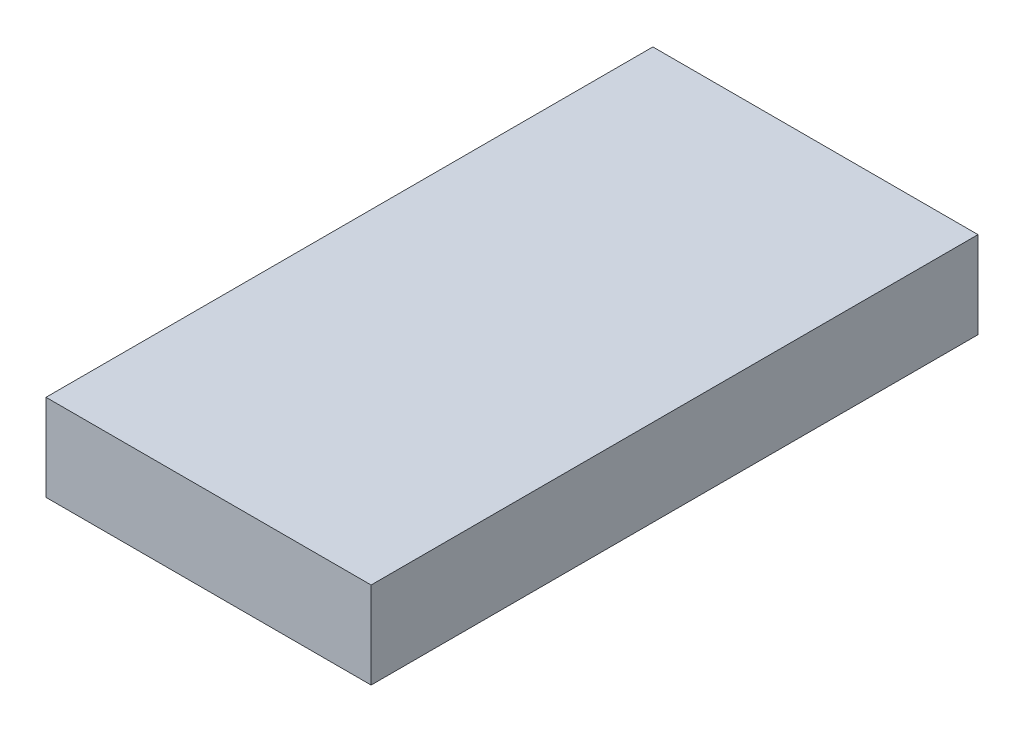
ISO-10303-21;
HEADER;
FILE_DESCRIPTION(('STEP AP214'),'2;1');
FILE_NAME('part.step','',(''),(''),'','','');
FILE_SCHEMA(('AUTOMOTIVE_DESIGN { 1 0 10303 214 1 1 1 1 }'));
ENDSEC;
DATA;
#1=APPLICATION_CONTEXT('core data for automotive mechanical design processes');
#2=APPLICATION_PROTOCOL_DEFINITION('international standard','automotive_design',2000,#1);
#3=PRODUCT_CONTEXT('',#1,'mechanical');
#4=PRODUCT('Part','Part','',(#3));
#5=PRODUCT_RELATED_PRODUCT_CATEGORY('part','',(#4));
#6=PRODUCT_DEFINITION_FORMATION('','',#4);
#7=PRODUCT_DEFINITION_CONTEXT('part definition',#1,'design');
#8=PRODUCT_DEFINITION('design','',#6,#7);
#9=PRODUCT_DEFINITION_SHAPE('','',#8);
#10=(LENGTH_UNIT() NAMED_UNIT(*) SI_UNIT(.MILLI.,.METRE.));
#11=(NAMED_UNIT(*) PLANE_ANGLE_UNIT() SI_UNIT($,.RADIAN.));
#12=(NAMED_UNIT(*) SI_UNIT($,.STERADIAN.) SOLID_ANGLE_UNIT());
#13=UNCERTAINTY_MEASURE_WITH_UNIT(LENGTH_MEASURE(1.E-05),#10,'distance_accuracy_value','');
#14=(GEOMETRIC_REPRESENTATION_CONTEXT(3) GLOBAL_UNCERTAINTY_ASSIGNED_CONTEXT((#13)) GLOBAL_UNIT_ASSIGNED_CONTEXT((#10,
#11,#12)) REPRESENTATION_CONTEXT('',''));
#15=CARTESIAN_POINT('',(0.,0.,0.));
#16=DIRECTION('',(0.,0.,1.));
#17=DIRECTION('',(1.,0.,0.));
#18=AXIS2_PLACEMENT_3D('',#15,#16,#17);
#19=CARTESIAN_POINT('',(-75.,40.,140.));
#20=DIRECTION('',(1.,0.,0.));
#21=DIRECTION('',(0.,0.,-1.));
#22=AXIS2_PLACEMENT_3D('',#19,#20,#21);
#23=PLANE('',#22);
#24=DIRECTION('',(0.,0.,1.));
#25=VECTOR('',#24,1.);
#26=CARTESIAN_POINT('',(-75.,0.,140.));
#27=LINE('',#26,#25);
#28=CARTESIAN_POINT('',(-75.,0.,-140.));
#29=VERTEX_POINT('',#28);
#30=CARTESIAN_POINT('',(-75.,0.,140.));
#31=VERTEX_POINT('',#30);
#32=EDGE_CURVE('E97',#29,#31,#27,.T.);
#33=ORIENTED_EDGE('',*,*,#32,.T.);
#34=DIRECTION('',(0.,-1.,0.));
#35=VECTOR('',#34,1.);
#36=CARTESIAN_POINT('',(-75.,40.,140.));
#37=LINE('',#36,#35);
#38=CARTESIAN_POINT('',(-75.,40.,140.));
#39=VERTEX_POINT('',#38);
#40=EDGE_CURVE('E11',#39,#31,#37,.T.);
#41=ORIENTED_EDGE('',*,*,#40,.F.);
#42=DIRECTION('',(0.,0.,1.));
#43=VECTOR('',#42,1.);
#44=CARTESIAN_POINT('',(-75.,40.,140.));
#45=LINE('',#44,#43);
#46=CARTESIAN_POINT('',(-75.,40.,-140.));
#47=VERTEX_POINT('',#46);
#48=EDGE_CURVE('E85',#47,#39,#45,.T.);
#49=ORIENTED_EDGE('',*,*,#48,.F.);
#50=DIRECTION('',(0.,-1.,0.));
#51=VECTOR('',#50,1.);
#52=CARTESIAN_POINT('',(-75.,40.,-140.));
#53=LINE('',#52,#51);
#54=EDGE_CURVE('E93',#47,#29,#53,.T.);
#55=ORIENTED_EDGE('',*,*,#54,.T.);
#56=EDGE_LOOP('',(#33,#41,#49,#55));
#57=FACE_BOUND('',#56,.T.);
#58=ADVANCED_FACE('F34',(#57),#23,.F.);
#59=CARTESIAN_POINT('',(75.,40.,140.));
#60=DIRECTION('',(0.,0.,-1.));
#61=DIRECTION('',(-1.,0.,0.));
#62=AXIS2_PLACEMENT_3D('',#59,#60,#61);
#63=PLANE('',#62);
#64=DIRECTION('',(1.,0.,0.));
#65=VECTOR('',#64,1.);
#66=CARTESIAN_POINT('',(75.,0.,140.));
#67=LINE('',#66,#65);
#68=CARTESIAN_POINT('',(75.,0.,140.));
#69=VERTEX_POINT('',#68);
#70=EDGE_CURVE('E89',#31,#69,#67,.T.);
#71=ORIENTED_EDGE('',*,*,#70,.T.);
#72=DIRECTION('',(0.,-1.,0.));
#73=VECTOR('',#72,1.);
#74=CARTESIAN_POINT('',(75.,40.,140.));
#75=LINE('',#74,#73);
#76=CARTESIAN_POINT('',(75.,40.,140.));
#77=VERTEX_POINT('',#76);
#78=EDGE_CURVE('E42',#77,#69,#75,.T.);
#79=ORIENTED_EDGE('',*,*,#78,.F.);
#80=DIRECTION('',(1.,0.,0.));
#81=VECTOR('',#80,1.);
#82=CARTESIAN_POINT('',(75.,40.,140.));
#83=LINE('',#82,#81);
#84=EDGE_CURVE('E80',#39,#77,#83,.T.);
#85=ORIENTED_EDGE('',*,*,#84,.F.);
#86=ORIENTED_EDGE('',*,*,#40,.T.);
#87=EDGE_LOOP('',(#71,#79,#85,#86));
#88=FACE_BOUND('',#87,.T.);
#89=ADVANCED_FACE('F88',(#88),#63,.F.);
#90=CARTESIAN_POINT('',(75.,40.,140.));
#91=DIRECTION('',(-1.,0.,0.));
#92=DIRECTION('',(0.,0.,1.));
#93=AXIS2_PLACEMENT_3D('',#90,#91,#92);
#94=PLANE('',#93);
#95=DIRECTION('',(0.,0.,-1.));
#96=VECTOR('',#95,1.);
#97=CARTESIAN_POINT('',(75.,0.,140.));
#98=LINE('',#97,#96);
#99=CARTESIAN_POINT('',(75.,0.,-140.));
#100=VERTEX_POINT('',#99);
#101=EDGE_CURVE('E67',#69,#100,#98,.T.);
#102=ORIENTED_EDGE('',*,*,#101,.T.);
#103=DIRECTION('',(0.,-1.,0.));
#104=VECTOR('',#103,1.);
#105=CARTESIAN_POINT('',(75.,40.,-140.));
#106=LINE('',#105,#104);
#107=CARTESIAN_POINT('',(75.,40.,-140.));
#108=VERTEX_POINT('',#107);
#109=EDGE_CURVE('E90',#108,#100,#106,.T.);
#110=ORIENTED_EDGE('',*,*,#109,.F.);
#111=DIRECTION('',(0.,0.,-1.));
#112=VECTOR('',#111,1.);
#113=CARTESIAN_POINT('',(75.,40.,140.));
#114=LINE('',#113,#112);
#115=EDGE_CURVE('E83',#77,#108,#114,.T.);
#116=ORIENTED_EDGE('',*,*,#115,.F.);
#117=ORIENTED_EDGE('',*,*,#78,.T.);
#118=EDGE_LOOP('',(#102,#110,#116,#117));
#119=FACE_BOUND('',#118,.T.);
#120=ADVANCED_FACE('F91',(#119),#94,.F.);
#121=CARTESIAN_POINT('',(75.,40.,-140.));
#122=DIRECTION('',(0.,0.,1.));
#123=DIRECTION('',(1.,0.,0.));
#124=AXIS2_PLACEMENT_3D('',#121,#122,#123);
#125=PLANE('',#124);
#126=DIRECTION('',(-1.,0.,0.));
#127=VECTOR('',#126,1.);
#128=CARTESIAN_POINT('',(75.,0.,-140.));
#129=LINE('',#128,#127);
#130=EDGE_CURVE('E73',#100,#29,#129,.T.);
#131=ORIENTED_EDGE('',*,*,#130,.T.);
#132=ORIENTED_EDGE('',*,*,#54,.F.);
#133=DIRECTION('',(-1.,0.,0.));
#134=VECTOR('',#133,1.);
#135=CARTESIAN_POINT('',(75.,40.,-140.));
#136=LINE('',#135,#134);
#137=EDGE_CURVE('E50',#108,#47,#136,.T.);
#138=ORIENTED_EDGE('',*,*,#137,.F.);
#139=ORIENTED_EDGE('',*,*,#109,.T.);
#140=EDGE_LOOP('',(#131,#132,#138,#139));
#141=FACE_BOUND('',#140,.T.);
#142=ADVANCED_FACE('F104',(#141),#125,.F.);
#143=CARTESIAN_POINT('',(0.,40.,0.));
#144=DIRECTION('',(0.,1.,0.));
#145=DIRECTION('',(0.,0.,1.));
#146=AXIS2_PLACEMENT_3D('',#143,#144,#145);
#147=PLANE('',#146);
#148=ORIENTED_EDGE('',*,*,#48,.T.);
#149=ORIENTED_EDGE('',*,*,#84,.T.);
#150=ORIENTED_EDGE('',*,*,#115,.T.);
#151=ORIENTED_EDGE('',*,*,#137,.T.);
#152=EDGE_LOOP('',(#148,#149,#150,#151));
#153=FACE_BOUND('',#152,.T.);
#154=ADVANCED_FACE('F81',(#153),#147,.T.);
#155=CARTESIAN_POINT('',(0.,0.,0.));
#156=DIRECTION('',(0.,1.,0.));
#157=DIRECTION('',(0.,0.,1.));
#158=AXIS2_PLACEMENT_3D('',#155,#156,#157);
#159=PLANE('',#158);
#160=ORIENTED_EDGE('',*,*,#32,.F.);
#161=ORIENTED_EDGE('',*,*,#130,.F.);
#162=ORIENTED_EDGE('',*,*,#101,.F.);
#163=ORIENTED_EDGE('',*,*,#70,.F.);
#164=EDGE_LOOP('',(#160,#161,#162,#163));
#165=FACE_BOUND('',#164,.T.);
#166=ADVANCED_FACE('F107',(#165),#159,.F.);
#167=CLOSED_SHELL('',(#58,#89,#120,#142,#154,#166));
#168=MANIFOLD_SOLID_BREP('B2',#167);
#169=ADVANCED_BREP_SHAPE_REPRESENTATION('',(#18,#168),#14);
#170=SHAPE_DEFINITION_REPRESENTATION(#9,#169);
ENDSEC;
END-ISO-10303-21;
